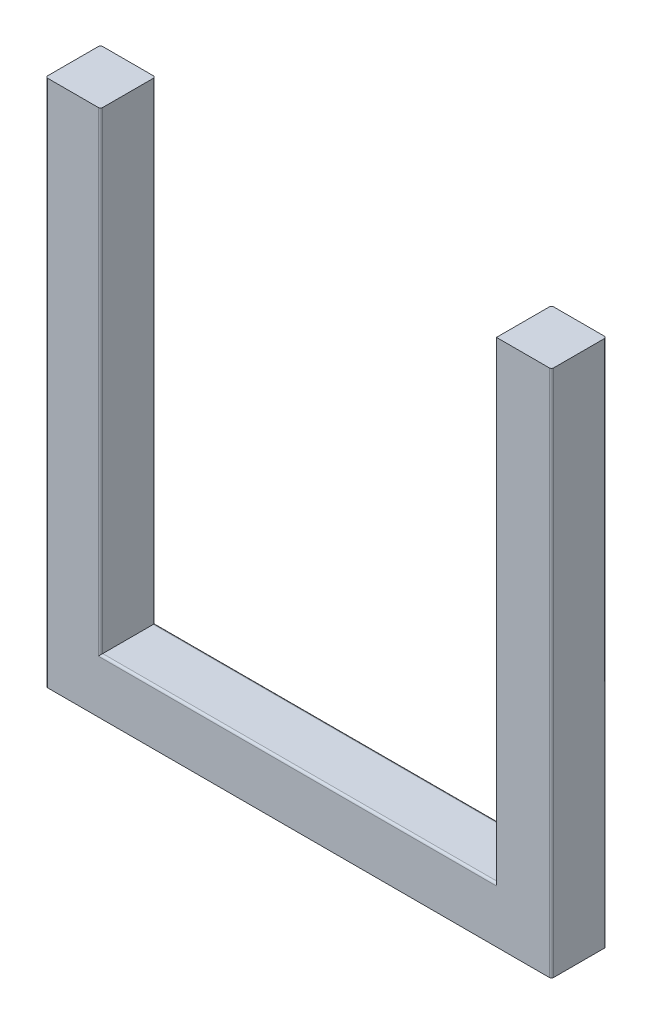
ISO-10303-21;
HEADER;
FILE_DESCRIPTION(('STEP AP214'),'2;1');
FILE_NAME('part.step','',(''),(''),'','','');
FILE_SCHEMA(('AUTOMOTIVE_DESIGN { 1 0 10303 214 1 1 1 1 }'));
ENDSEC;
DATA;
#1=APPLICATION_CONTEXT('core data for automotive mechanical design processes');
#2=APPLICATION_PROTOCOL_DEFINITION('international standard','automotive_design',2000,#1);
#3=PRODUCT_CONTEXT('',#1,'mechanical');
#4=PRODUCT('Part','Part','',(#3));
#5=PRODUCT_RELATED_PRODUCT_CATEGORY('part','',(#4));
#6=PRODUCT_DEFINITION_FORMATION('','',#4);
#7=PRODUCT_DEFINITION_CONTEXT('part definition',#1,'design');
#8=PRODUCT_DEFINITION('design','',#6,#7);
#9=PRODUCT_DEFINITION_SHAPE('','',#8);
#10=(LENGTH_UNIT() NAMED_UNIT(*) SI_UNIT(.MILLI.,.METRE.));
#11=(NAMED_UNIT(*) PLANE_ANGLE_UNIT() SI_UNIT($,.RADIAN.));
#12=(NAMED_UNIT(*) SI_UNIT($,.STERADIAN.) SOLID_ANGLE_UNIT());
#13=UNCERTAINTY_MEASURE_WITH_UNIT(LENGTH_MEASURE(1.E-05),#10,'distance_accuracy_value','');
#14=(GEOMETRIC_REPRESENTATION_CONTEXT(3) GLOBAL_UNCERTAINTY_ASSIGNED_CONTEXT((#13)) GLOBAL_UNIT_ASSIGNED_CONTEXT((#10,
#11,#12)) REPRESENTATION_CONTEXT('',''));
#15=CARTESIAN_POINT('',(0.,0.,0.));
#16=DIRECTION('',(0.,0.,1.));
#17=DIRECTION('',(1.,0.,0.));
#18=AXIS2_PLACEMENT_3D('',#15,#16,#17);
#19=CARTESIAN_POINT('',(49.9999999999998,0.,50.));
#20=DIRECTION('',(1.,0.,0.));
#21=DIRECTION('',(0.,0.,-1.));
#22=AXIS2_PLACEMENT_3D('',#19,#20,#21);
#23=PLANE('',#22);
#24=DIRECTION('',(0.,0.,-1.));
#25=VECTOR('',#24,1.);
#26=CARTESIAN_POINT('',(49.9999999999998,480.,50.));
#27=LINE('',#26,#25);
#28=CARTESIAN_POINT('',(49.9999999999998,480.,48.));
#29=VERTEX_POINT('',#28);
#30=CARTESIAN_POINT('',(49.9999999999998,480.,2.));
#31=VERTEX_POINT('',#30);
#32=EDGE_CURVE('E199',#29,#31,#27,.T.);
#33=ORIENTED_EDGE('',*,*,#32,.F.);
#34=DIRECTION('',(0.,-1.,0.));
#35=VECTOR('',#34,1.);
#36=CARTESIAN_POINT('',(49.9999999999998,0.,48.));
#37=LINE('',#36,#35);
#38=CARTESIAN_POINT('',(49.9999999999998,50.,48.));
#39=VERTEX_POINT('',#38);
#40=EDGE_CURVE('E215',#29,#39,#37,.T.);
#41=ORIENTED_EDGE('',*,*,#40,.T.);
#42=DIRECTION('',(0.,0.,-1.));
#43=VECTOR('',#42,1.);
#44=CARTESIAN_POINT('',(49.9999999999998,50.,50.));
#45=LINE('',#44,#43);
#46=CARTESIAN_POINT('',(49.9999999999998,50.,2.));
#47=VERTEX_POINT('',#46);
#48=EDGE_CURVE('E173',#39,#47,#45,.T.);
#49=ORIENTED_EDGE('',*,*,#48,.T.);
#50=DIRECTION('',(0.,-1.,0.));
#51=VECTOR('',#50,1.);
#52=CARTESIAN_POINT('',(49.9999999999998,480.,2.));
#53=LINE('',#52,#51);
#54=EDGE_CURVE('E213',#47,#31,#53,.F.);
#55=ORIENTED_EDGE('',*,*,#54,.T.);
#56=EDGE_LOOP('',(#33,#41,#49,#55));
#57=FACE_BOUND('',#56,.T.);
#58=ADVANCED_FACE('F35',(#57),#23,.T.);
#59=CARTESIAN_POINT('',(0.,480.,50.));
#60=DIRECTION('',(0.,1.,0.));
#61=DIRECTION('',(0.,0.,1.));
#62=AXIS2_PLACEMENT_3D('',#59,#60,#61);
#63=PLANE('',#62);
#64=DIRECTION('',(1.,0.,0.));
#65=VECTOR('',#64,1.);
#66=CARTESIAN_POINT('',(0.,480.,50.));
#67=LINE('',#66,#65);
#68=CARTESIAN_POINT('',(2.,480.,50.));
#69=VERTEX_POINT('',#68);
#70=CARTESIAN_POINT('',(47.9999999999998,480.,50.));
#71=VERTEX_POINT('',#70);
#72=EDGE_CURVE('E184',#69,#71,#67,.T.);
#73=ORIENTED_EDGE('',*,*,#72,.T.);
#74=CARTESIAN_POINT('',(47.9999999999998,480.,48.));
#75=DIRECTION('',(0.,1.,0.));
#76=DIRECTION('',(0.,0.,1.));
#77=AXIS2_PLACEMENT_3D('',#74,#75,#76);
#78=CIRCLE('',#77,2.);
#79=EDGE_CURVE('E223',#71,#29,#78,.T.);
#80=ORIENTED_EDGE('',*,*,#79,.T.);
#81=ORIENTED_EDGE('',*,*,#32,.T.);
#82=CARTESIAN_POINT('',(47.9999999999998,480.,2.));
#83=DIRECTION('',(0.,1.,0.));
#84=DIRECTION('',(0.,0.,1.));
#85=AXIS2_PLACEMENT_3D('',#82,#83,#84);
#86=CIRCLE('',#85,2.);
#87=CARTESIAN_POINT('',(47.9999999999998,480.,0.));
#88=VERTEX_POINT('',#87);
#89=EDGE_CURVE('E217',#31,#88,#86,.T.);
#90=ORIENTED_EDGE('',*,*,#89,.T.);
#91=DIRECTION('',(1.,0.,0.));
#92=VECTOR('',#91,1.);
#93=CARTESIAN_POINT('',(0.,480.,0.));
#94=LINE('',#93,#92);
#95=CARTESIAN_POINT('',(2.,480.,0.));
#96=VERTEX_POINT('',#95);
#97=EDGE_CURVE('E179',#96,#88,#94,.T.);
#98=ORIENTED_EDGE('',*,*,#97,.F.);
#99=CARTESIAN_POINT('',(2.,480.,2.));
#100=DIRECTION('',(0.,1.,0.));
#101=DIRECTION('',(0.,0.,1.));
#102=AXIS2_PLACEMENT_3D('',#99,#100,#101);
#103=CIRCLE('',#102,2.);
#104=CARTESIAN_POINT('',(0.,480.,2.));
#105=VERTEX_POINT('',#104);
#106=EDGE_CURVE('E219',#96,#105,#103,.T.);
#107=ORIENTED_EDGE('',*,*,#106,.T.);
#108=DIRECTION('',(0.,0.,-1.));
#109=VECTOR('',#108,1.);
#110=CARTESIAN_POINT('',(0.,480.,50.));
#111=LINE('',#110,#109);
#112=CARTESIAN_POINT('',(0.,480.,48.));
#113=VERTEX_POINT('',#112);
#114=EDGE_CURVE('E196',#113,#105,#111,.T.);
#115=ORIENTED_EDGE('',*,*,#114,.F.);
#116=CARTESIAN_POINT('',(2.,480.,48.));
#117=DIRECTION('',(0.,1.,0.));
#118=DIRECTION('',(0.,0.,1.));
#119=AXIS2_PLACEMENT_3D('',#116,#117,#118);
#120=CIRCLE('',#119,2.);
#121=EDGE_CURVE('E221',#113,#69,#120,.T.);
#122=ORIENTED_EDGE('',*,*,#121,.T.);
#123=EDGE_LOOP('',(#73,#80,#81,#90,#98,#107,#115,#122));
#124=FACE_BOUND('',#123,.T.);
#125=ADVANCED_FACE('F300',(#124),#63,.T.);
#126=CARTESIAN_POINT('',(0.,0.,50.));
#127=DIRECTION('',(-1.,0.,0.));
#128=DIRECTION('',(0.,0.,1.));
#129=AXIS2_PLACEMENT_3D('',#126,#127,#128);
#130=PLANE('',#129);
#131=DIRECTION('',(0.,0.,-1.));
#132=VECTOR('',#131,1.);
#133=CARTESIAN_POINT('',(0.,0.,50.));
#134=LINE('',#133,#132);
#135=CARTESIAN_POINT('',(0.,0.,48.));
#136=VERTEX_POINT('',#135);
#137=CARTESIAN_POINT('',(0.,0.,2.));
#138=VERTEX_POINT('',#137);
#139=EDGE_CURVE('E193',#136,#138,#134,.T.);
#140=ORIENTED_EDGE('',*,*,#139,.F.);
#141=DIRECTION('',(0.,1.,0.));
#142=VECTOR('',#141,1.);
#143=CARTESIAN_POINT('',(0.,0.,48.));
#144=LINE('',#143,#142);
#145=EDGE_CURVE('E227',#136,#113,#144,.T.);
#146=ORIENTED_EDGE('',*,*,#145,.T.);
#147=ORIENTED_EDGE('',*,*,#114,.T.);
#148=DIRECTION('',(0.,1.,0.));
#149=VECTOR('',#148,1.);
#150=CARTESIAN_POINT('',(0.,0.,2.));
#151=LINE('',#150,#149);
#152=EDGE_CURVE('E225',#105,#138,#151,.F.);
#153=ORIENTED_EDGE('',*,*,#152,.T.);
#154=EDGE_LOOP('',(#140,#146,#147,#153));
#155=FACE_BOUND('',#154,.T.);
#156=ADVANCED_FACE('F327',(#155),#130,.T.);
#157=CARTESIAN_POINT('',(0.,0.,50.));
#158=DIRECTION('',(0.,1.,0.));
#159=DIRECTION('',(0.,0.,1.));
#160=AXIS2_PLACEMENT_3D('',#157,#158,#159);
#161=PLANE('',#160);
#162=DIRECTION('',(1.,0.,0.));
#163=VECTOR('',#162,1.);
#164=CARTESIAN_POINT('',(0.,0.,50.));
#165=LINE('',#164,#163);
#166=CARTESIAN_POINT('',(2.,0.,50.));
#167=VERTEX_POINT('',#166);
#168=CARTESIAN_POINT('',(458.,0.,50.));
#169=VERTEX_POINT('',#168);
#170=EDGE_CURVE('E156',#167,#169,#165,.T.);
#171=ORIENTED_EDGE('',*,*,#170,.F.);
#172=CARTESIAN_POINT('',(2.,0.,48.));
#173=DIRECTION('',(0.,1.,0.));
#174=DIRECTION('',(0.,0.,1.));
#175=AXIS2_PLACEMENT_3D('',#172,#173,#174);
#176=CIRCLE('',#175,2.);
#177=EDGE_CURVE('E234',#167,#136,#176,.F.);
#178=ORIENTED_EDGE('',*,*,#177,.T.);
#179=ORIENTED_EDGE('',*,*,#139,.T.);
#180=DIRECTION('',(1.,0.,0.));
#181=VECTOR('',#180,1.);
#182=CARTESIAN_POINT('',(0.,0.,2.));
#183=LINE('',#182,#181);
#184=CARTESIAN_POINT('',(460.,0.,2.));
#185=VERTEX_POINT('',#184);
#186=EDGE_CURVE('E230',#138,#185,#183,.T.);
#187=ORIENTED_EDGE('',*,*,#186,.T.);
#188=DIRECTION('',(0.,0.,-1.));
#189=VECTOR('',#188,1.);
#190=CARTESIAN_POINT('',(460.,0.,50.));
#191=LINE('',#190,#189);
#192=CARTESIAN_POINT('',(460.,0.,48.));
#193=VERTEX_POINT('',#192);
#194=EDGE_CURVE('E190',#193,#185,#191,.T.);
#195=ORIENTED_EDGE('',*,*,#194,.F.);
#196=CARTESIAN_POINT('',(458.,0.,48.));
#197=DIRECTION('',(0.,1.,0.));
#198=DIRECTION('',(0.,0.,1.));
#199=AXIS2_PLACEMENT_3D('',#196,#197,#198);
#200=CIRCLE('',#199,2.);
#201=EDGE_CURVE('E232',#193,#169,#200,.F.);
#202=ORIENTED_EDGE('',*,*,#201,.T.);
#203=EDGE_LOOP('',(#171,#178,#179,#187,#195,#202));
#204=FACE_BOUND('',#203,.T.);
#205=ADVANCED_FACE('F325',(#204),#161,.F.);
#206=CARTESIAN_POINT('',(460.,0.,50.));
#207=DIRECTION('',(-1.,0.,0.));
#208=DIRECTION('',(0.,0.,1.));
#209=AXIS2_PLACEMENT_3D('',#206,#207,#208);
#210=PLANE('',#209);
#211=DIRECTION('',(0.,0.,-1.));
#212=VECTOR('',#211,1.);
#213=CARTESIAN_POINT('',(460.,480.,50.));
#214=LINE('',#213,#212);
#215=CARTESIAN_POINT('',(460.,480.,48.));
#216=VERTEX_POINT('',#215);
#217=CARTESIAN_POINT('',(460.,480.,2.));
#218=VERTEX_POINT('',#217);
#219=EDGE_CURVE('E166',#216,#218,#214,.T.);
#220=ORIENTED_EDGE('',*,*,#219,.F.);
#221=DIRECTION('',(0.,1.,0.));
#222=VECTOR('',#221,1.);
#223=CARTESIAN_POINT('',(460.,0.,48.));
#224=LINE('',#223,#222);
#225=EDGE_CURVE('E244',#216,#193,#224,.F.);
#226=ORIENTED_EDGE('',*,*,#225,.T.);
#227=ORIENTED_EDGE('',*,*,#194,.T.);
#228=DIRECTION('',(0.,1.,0.));
#229=VECTOR('',#228,1.);
#230=CARTESIAN_POINT('',(460.,0.,2.));
#231=LINE('',#230,#229);
#232=EDGE_CURVE('E241',#185,#218,#231,.T.);
#233=ORIENTED_EDGE('',*,*,#232,.T.);
#234=EDGE_LOOP('',(#220,#226,#227,#233));
#235=FACE_BOUND('',#234,.T.);
#236=ADVANCED_FACE('F283',(#235),#210,.F.);
#237=CARTESIAN_POINT('',(0.,480.,50.));
#238=DIRECTION('',(0.,-1.,0.));
#239=DIRECTION('',(0.,0.,-1.));
#240=AXIS2_PLACEMENT_3D('',#237,#238,#239);
#241=PLANE('',#240);
#242=DIRECTION('',(-1.,0.,0.));
#243=VECTOR('',#242,1.);
#244=CARTESIAN_POINT('',(0.,480.,50.));
#245=LINE('',#244,#243);
#246=CARTESIAN_POINT('',(458.,480.,50.));
#247=VERTEX_POINT('',#246);
#248=CARTESIAN_POINT('',(410.,480.,50.));
#249=VERTEX_POINT('',#248);
#250=EDGE_CURVE('E146',#247,#249,#245,.T.);
#251=ORIENTED_EDGE('',*,*,#250,.F.);
#252=CARTESIAN_POINT('',(458.,480.,48.));
#253=DIRECTION('',(0.,-1.,0.));
#254=DIRECTION('',(0.,0.,-1.));
#255=AXIS2_PLACEMENT_3D('',#252,#253,#254);
#256=CIRCLE('',#255,2.);
#257=EDGE_CURVE('E239',#247,#216,#256,.F.);
#258=ORIENTED_EDGE('',*,*,#257,.T.);
#259=ORIENTED_EDGE('',*,*,#219,.T.);
#260=CARTESIAN_POINT('',(458.,480.,2.));
#261=DIRECTION('',(0.,-1.,0.));
#262=DIRECTION('',(0.,0.,-1.));
#263=AXIS2_PLACEMENT_3D('',#260,#261,#262);
#264=CIRCLE('',#263,2.);
#265=CARTESIAN_POINT('',(458.,480.,0.));
#266=VERTEX_POINT('',#265);
#267=EDGE_CURVE('E237',#218,#266,#264,.F.);
#268=ORIENTED_EDGE('',*,*,#267,.T.);
#269=DIRECTION('',(-1.,0.,0.));
#270=VECTOR('',#269,1.);
#271=CARTESIAN_POINT('',(0.,480.,0.));
#272=LINE('',#271,#270);
#273=CARTESIAN_POINT('',(412.,480.,0.));
#274=VERTEX_POINT('',#273);
#275=EDGE_CURVE('E182',#266,#274,#272,.T.);
#276=ORIENTED_EDGE('',*,*,#275,.T.);
#277=CARTESIAN_POINT('',(412.,480.,2.));
#278=DIRECTION('',(0.,-1.,0.));
#279=DIRECTION('',(0.,0.,-1.));
#280=AXIS2_PLACEMENT_3D('',#277,#278,#279);
#281=CIRCLE('',#280,2.);
#282=CARTESIAN_POINT('',(410.,480.,2.));
#283=VERTEX_POINT('',#282);
#284=EDGE_CURVE('E163',#274,#283,#281,.F.);
#285=ORIENTED_EDGE('',*,*,#284,.T.);
#286=DIRECTION('',(0.,0.,-1.));
#287=VECTOR('',#286,1.);
#288=CARTESIAN_POINT('',(410.,480.,50.));
#289=LINE('',#288,#287);
#290=EDGE_CURVE('E159',#249,#283,#289,.T.);
#291=ORIENTED_EDGE('',*,*,#290,.F.);
#292=EDGE_LOOP('',(#251,#258,#259,#268,#276,#285,#291));
#293=FACE_BOUND('',#292,.T.);
#294=ADVANCED_FACE('F160',(#293),#241,.F.);
#295=CARTESIAN_POINT('',(410.,0.,50.));
#296=DIRECTION('',(-1.,0.,0.));
#297=DIRECTION('',(0.,0.,1.));
#298=AXIS2_PLACEMENT_3D('',#295,#296,#297);
#299=PLANE('',#298);
#300=ORIENTED_EDGE('',*,*,#290,.T.);
#301=DIRECTION('',(0.,1.,0.));
#302=VECTOR('',#301,1.);
#303=CARTESIAN_POINT('',(410.,50.,2.));
#304=LINE('',#303,#302);
#305=CARTESIAN_POINT('',(410.,50.,2.));
#306=VERTEX_POINT('',#305);
#307=EDGE_CURVE('E44',#283,#306,#304,.F.);
#308=ORIENTED_EDGE('',*,*,#307,.T.);
#309=DIRECTION('',(0.,0.,-1.));
#310=VECTOR('',#309,1.);
#311=CARTESIAN_POINT('',(410.,50.,50.));
#312=LINE('',#311,#310);
#313=CARTESIAN_POINT('',(410.,50.,48.));
#314=VERTEX_POINT('',#313);
#315=EDGE_CURVE('E167',#314,#306,#312,.T.);
#316=ORIENTED_EDGE('',*,*,#315,.F.);
#317=CARTESIAN_POINT('',(410.,48.,48.));
#318=DIRECTION('',(-1.,0.,0.));
#319=DIRECTION('',(0.,0.,1.));
#320=AXIS2_PLACEMENT_3D('',#317,#318,#319);
#321=CIRCLE('',#320,2.);
#322=CARTESIAN_POINT('',(410.,48.,50.));
#323=VERTEX_POINT('',#322);
#324=EDGE_CURVE('E11',#314,#323,#321,.F.);
#325=ORIENTED_EDGE('',*,*,#324,.T.);
#326=DIRECTION('',(0.,1.,0.));
#327=VECTOR('',#326,1.);
#328=CARTESIAN_POINT('',(410.,0.,50.));
#329=LINE('',#328,#327);
#330=EDGE_CURVE('E151',#323,#249,#329,.T.);
#331=ORIENTED_EDGE('',*,*,#330,.T.);
#332=EDGE_LOOP('',(#300,#308,#316,#325,#331));
#333=FACE_BOUND('',#332,.T.);
#334=ADVANCED_FACE('F169',(#333),#299,.T.);
#335=CARTESIAN_POINT('',(0.,50.,50.));
#336=DIRECTION('',(0.,-1.,0.));
#337=DIRECTION('',(1.,0.,0.));
#338=AXIS2_PLACEMENT_3D('',#335,#336,#337);
#339=PLANE('',#338);
#340=ORIENTED_EDGE('',*,*,#48,.F.);
#341=DIRECTION('',(-1.,0.,0.));
#342=VECTOR('',#341,1.);
#343=CARTESIAN_POINT('',(410.,50.,48.));
#344=LINE('',#343,#342);
#345=EDGE_CURVE('E211',#39,#314,#344,.F.);
#346=ORIENTED_EDGE('',*,*,#345,.T.);
#347=ORIENTED_EDGE('',*,*,#315,.T.);
#348=DIRECTION('',(-1.,0.,0.));
#349=VECTOR('',#348,1.);
#350=CARTESIAN_POINT('',(0.,50.,2.));
#351=LINE('',#350,#349);
#352=EDGE_CURVE('E209',#306,#47,#351,.T.);
#353=ORIENTED_EDGE('',*,*,#352,.T.);
#354=EDGE_LOOP('',(#340,#346,#347,#353));
#355=FACE_BOUND('',#354,.T.);
#356=ADVANCED_FACE('F310',(#355),#339,.F.);
#357=CARTESIAN_POINT('',(0.,0.,50.));
#358=DIRECTION('',(0.,0.,1.));
#359=DIRECTION('',(1.,0.,0.));
#360=AXIS2_PLACEMENT_3D('',#357,#358,#359);
#361=PLANE('',#360);
#362=ORIENTED_EDGE('',*,*,#330,.F.);
#363=DIRECTION('',(-1.,0.,0.));
#364=VECTOR('',#363,1.);
#365=CARTESIAN_POINT('',(49.9999999999998,48.,50.));
#366=LINE('',#365,#364);
#367=CARTESIAN_POINT('',(47.9999999999998,48.,50.));
#368=VERTEX_POINT('',#367);
#369=EDGE_CURVE('E207',#323,#368,#366,.T.);
#370=ORIENTED_EDGE('',*,*,#369,.T.);
#371=DIRECTION('',(0.,-1.,0.));
#372=VECTOR('',#371,1.);
#373=CARTESIAN_POINT('',(47.9999999999998,0.,50.));
#374=LINE('',#373,#372);
#375=EDGE_CURVE('E205',#368,#71,#374,.F.);
#376=ORIENTED_EDGE('',*,*,#375,.T.);
#377=ORIENTED_EDGE('',*,*,#72,.F.);
#378=DIRECTION('',(0.,1.,0.));
#379=VECTOR('',#378,1.);
#380=CARTESIAN_POINT('',(2.,0.,50.));
#381=LINE('',#380,#379);
#382=EDGE_CURVE('E203',#69,#167,#381,.F.);
#383=ORIENTED_EDGE('',*,*,#382,.T.);
#384=ORIENTED_EDGE('',*,*,#170,.T.);
#385=DIRECTION('',(0.,1.,0.));
#386=VECTOR('',#385,1.);
#387=CARTESIAN_POINT('',(458.,480.,50.));
#388=LINE('',#387,#386);
#389=EDGE_CURVE('E154',#169,#247,#388,.T.);
#390=ORIENTED_EDGE('',*,*,#389,.T.);
#391=ORIENTED_EDGE('',*,*,#250,.T.);
#392=EDGE_LOOP('',(#362,#370,#376,#377,#383,#384,#390,#391));
#393=FACE_BOUND('',#392,.T.);
#394=ADVANCED_FACE('F148',(#393),#361,.T.);
#395=CARTESIAN_POINT('',(0.,0.,0.));
#396=DIRECTION('',(0.,0.,1.));
#397=DIRECTION('',(1.,0.,0.));
#398=AXIS2_PLACEMENT_3D('',#395,#396,#397);
#399=PLANE('',#398);
#400=ORIENTED_EDGE('',*,*,#275,.F.);
#401=DIRECTION('',(0.,1.,0.));
#402=VECTOR('',#401,1.);
#403=CARTESIAN_POINT('',(458.,0.,0.));
#404=LINE('',#403,#402);
#405=CARTESIAN_POINT('',(458.,2.,0.));
#406=VERTEX_POINT('',#405);
#407=EDGE_CURVE('E52',#266,#406,#404,.F.);
#408=ORIENTED_EDGE('',*,*,#407,.T.);
#409=DIRECTION('',(1.,0.,0.));
#410=VECTOR('',#409,1.);
#411=CARTESIAN_POINT('',(0.,2.,0.));
#412=LINE('',#411,#410);
#413=CARTESIAN_POINT('',(2.,2.,0.));
#414=VERTEX_POINT('',#413);
#415=EDGE_CURVE('E56',#406,#414,#412,.F.);
#416=ORIENTED_EDGE('',*,*,#415,.T.);
#417=DIRECTION('',(0.,1.,0.));
#418=VECTOR('',#417,1.);
#419=CARTESIAN_POINT('',(2.,480.,0.));
#420=LINE('',#419,#418);
#421=EDGE_CURVE('E253',#414,#96,#420,.T.);
#422=ORIENTED_EDGE('',*,*,#421,.T.);
#423=ORIENTED_EDGE('',*,*,#97,.T.);
#424=DIRECTION('',(0.,-1.,0.));
#425=VECTOR('',#424,1.);
#426=CARTESIAN_POINT('',(47.9999999999998,50.,0.));
#427=LINE('',#426,#425);
#428=CARTESIAN_POINT('',(47.9999999999998,48.,0.));
#429=VERTEX_POINT('',#428);
#430=EDGE_CURVE('E250',#88,#429,#427,.T.);
#431=ORIENTED_EDGE('',*,*,#430,.T.);
#432=DIRECTION('',(-1.,0.,0.));
#433=VECTOR('',#432,1.);
#434=CARTESIAN_POINT('',(0.,48.,0.));
#435=LINE('',#434,#433);
#436=CARTESIAN_POINT('',(412.,48.,0.));
#437=VERTEX_POINT('',#436);
#438=EDGE_CURVE('E246',#429,#437,#435,.F.);
#439=ORIENTED_EDGE('',*,*,#438,.T.);
#440=DIRECTION('',(0.,1.,0.));
#441=VECTOR('',#440,1.);
#442=CARTESIAN_POINT('',(412.,480.,0.));
#443=LINE('',#442,#441);
#444=EDGE_CURVE('E248',#437,#274,#443,.T.);
#445=ORIENTED_EDGE('',*,*,#444,.T.);
#446=EDGE_LOOP('',(#400,#408,#416,#422,#423,#431,#439,#445));
#447=FACE_BOUND('',#446,.T.);
#448=ADVANCED_FACE('F277',(#447),#399,.F.);
#449=CARTESIAN_POINT('',(47.9999999999998,0.,48.));
#450=DIRECTION('',(0.,-1.,0.));
#451=DIRECTION('',(0.,0.,-1.));
#452=AXIS2_PLACEMENT_3D('',#449,#450,#451);
#453=CYLINDRICAL_SURFACE('',#452,2.);
#454=ORIENTED_EDGE('',*,*,#79,.F.);
#455=ORIENTED_EDGE('',*,*,#375,.F.);
#456=CARTESIAN_POINT('',(47.9999999999998,48.,48.));
#457=DIRECTION('',(0.707106781186547,-0.707106781186547,0.));
#458=DIRECTION('',(0.707106781186547,0.707106781186547,0.));
#459=AXIS2_PLACEMENT_3D('',#456,#457,#458);
#460=ELLIPSE('',#459,2.82842712474619,2.);
#461=EDGE_CURVE('E183',#39,#368,#460,.T.);
#462=ORIENTED_EDGE('',*,*,#461,.F.);
#463=ORIENTED_EDGE('',*,*,#40,.F.);
#464=EDGE_LOOP('',(#454,#455,#462,#463));
#465=FACE_BOUND('',#464,.T.);
#466=ADVANCED_FACE('F317',(#465),#453,.T.);
#467=CARTESIAN_POINT('',(0.,48.,48.));
#468=DIRECTION('',(1.,0.,0.));
#469=DIRECTION('',(0.,1.,0.));
#470=AXIS2_PLACEMENT_3D('',#467,#468,#469);
#471=CYLINDRICAL_SURFACE('',#470,2.);
#472=ORIENTED_EDGE('',*,*,#324,.F.);
#473=ORIENTED_EDGE('',*,*,#345,.F.);
#474=ORIENTED_EDGE('',*,*,#461,.T.);
#475=ORIENTED_EDGE('',*,*,#369,.F.);
#476=EDGE_LOOP('',(#472,#473,#474,#475));
#477=FACE_BOUND('',#476,.T.);
#478=ADVANCED_FACE('F313',(#477),#471,.T.);
#479=CARTESIAN_POINT('',(2.,0.,48.));
#480=DIRECTION('',(0.,1.,0.));
#481=DIRECTION('',(0.,0.,1.));
#482=AXIS2_PLACEMENT_3D('',#479,#480,#481);
#483=CYLINDRICAL_SURFACE('',#482,2.);
#484=ORIENTED_EDGE('',*,*,#177,.F.);
#485=ORIENTED_EDGE('',*,*,#382,.F.);
#486=ORIENTED_EDGE('',*,*,#121,.F.);
#487=ORIENTED_EDGE('',*,*,#145,.F.);
#488=EDGE_LOOP('',(#484,#485,#486,#487));
#489=FACE_BOUND('',#488,.T.);
#490=ADVANCED_FACE('F345',(#489),#483,.T.);
#491=CARTESIAN_POINT('',(458.,0.,48.));
#492=DIRECTION('',(0.,-1.,0.));
#493=DIRECTION('',(0.,0.,-1.));
#494=AXIS2_PLACEMENT_3D('',#491,#492,#493);
#495=CYLINDRICAL_SURFACE('',#494,2.);
#496=ORIENTED_EDGE('',*,*,#201,.F.);
#497=ORIENTED_EDGE('',*,*,#225,.F.);
#498=ORIENTED_EDGE('',*,*,#257,.F.);
#499=ORIENTED_EDGE('',*,*,#389,.F.);
#500=EDGE_LOOP('',(#496,#497,#498,#499));
#501=FACE_BOUND('',#500,.T.);
#502=ADVANCED_FACE('F324',(#501),#495,.T.);
#503=CARTESIAN_POINT('',(2.,0.,2.));
#504=DIRECTION('',(0.,-1.,0.));
#505=DIRECTION('',(0.,0.,-1.));
#506=AXIS2_PLACEMENT_3D('',#503,#504,#505);
#507=CYLINDRICAL_SURFACE('',#506,2.);
#508=ORIENTED_EDGE('',*,*,#106,.F.);
#509=ORIENTED_EDGE('',*,*,#421,.F.);
#510=CARTESIAN_POINT('',(2.,2.,2.));
#511=DIRECTION('',(0.707106781186547,-0.707106781186547,0.));
#512=DIRECTION('',(-0.707106781186547,-0.707106781186547,0.));
#513=AXIS2_PLACEMENT_3D('',#510,#511,#512);
#514=ELLIPSE('',#513,2.82842712474619,2.);
#515=EDGE_CURVE('E259',#138,#414,#514,.T.);
#516=ORIENTED_EDGE('',*,*,#515,.F.);
#517=ORIENTED_EDGE('',*,*,#152,.F.);
#518=EDGE_LOOP('',(#508,#509,#516,#517));
#519=FACE_BOUND('',#518,.T.);
#520=ADVANCED_FACE('F296',(#519),#507,.T.);
#521=CARTESIAN_POINT('',(0.,2.,2.));
#522=DIRECTION('',(1.,0.,0.));
#523=DIRECTION('',(0.,0.,-1.));
#524=AXIS2_PLACEMENT_3D('',#521,#522,#523);
#525=CYLINDRICAL_SURFACE('',#524,2.);
#526=ORIENTED_EDGE('',*,*,#515,.T.);
#527=ORIENTED_EDGE('',*,*,#415,.F.);
#528=CARTESIAN_POINT('',(458.,2.,2.));
#529=DIRECTION('',(0.707106781186547,0.707106781186547,0.));
#530=DIRECTION('',(0.707106781186547,-0.707106781186547,0.));
#531=AXIS2_PLACEMENT_3D('',#528,#529,#530);
#532=ELLIPSE('',#531,2.82842712474619,2.);
#533=EDGE_CURVE('E260',#185,#406,#532,.T.);
#534=ORIENTED_EDGE('',*,*,#533,.F.);
#535=ORIENTED_EDGE('',*,*,#186,.F.);
#536=EDGE_LOOP('',(#526,#527,#534,#535));
#537=FACE_BOUND('',#536,.T.);
#538=ADVANCED_FACE('F291',(#537),#525,.T.);
#539=CARTESIAN_POINT('',(458.,0.,2.));
#540=DIRECTION('',(0.,1.,0.));
#541=DIRECTION('',(0.,0.,1.));
#542=AXIS2_PLACEMENT_3D('',#539,#540,#541);
#543=CYLINDRICAL_SURFACE('',#542,2.);
#544=ORIENTED_EDGE('',*,*,#533,.T.);
#545=ORIENTED_EDGE('',*,*,#407,.F.);
#546=ORIENTED_EDGE('',*,*,#267,.F.);
#547=ORIENTED_EDGE('',*,*,#232,.F.);
#548=EDGE_LOOP('',(#544,#545,#546,#547));
#549=FACE_BOUND('',#548,.T.);
#550=ADVANCED_FACE('F281',(#549),#543,.T.);
#551=CARTESIAN_POINT('',(412.,0.,2.));
#552=DIRECTION('',(0.,-1.,0.));
#553=DIRECTION('',(0.,0.,-1.));
#554=AXIS2_PLACEMENT_3D('',#551,#552,#553);
#555=CYLINDRICAL_SURFACE('',#554,2.);
#556=ORIENTED_EDGE('',*,*,#284,.F.);
#557=ORIENTED_EDGE('',*,*,#444,.F.);
#558=CARTESIAN_POINT('',(412.,48.,2.));
#559=DIRECTION('',(-0.707106781186547,-0.707106781186547,0.));
#560=DIRECTION('',(0.707106781186547,-0.707106781186547,0.));
#561=AXIS2_PLACEMENT_3D('',#558,#559,#560);
#562=ELLIPSE('',#561,2.82842712474619,2.);
#563=EDGE_CURVE('E39',#306,#437,#562,.T.);
#564=ORIENTED_EDGE('',*,*,#563,.F.);
#565=ORIENTED_EDGE('',*,*,#307,.F.);
#566=EDGE_LOOP('',(#556,#557,#564,#565));
#567=FACE_BOUND('',#566,.T.);
#568=ADVANCED_FACE('F37',(#567),#555,.T.);
#569=CARTESIAN_POINT('',(0.,48.,2.));
#570=DIRECTION('',(-1.,0.,0.));
#571=DIRECTION('',(0.,-1.,0.));
#572=AXIS2_PLACEMENT_3D('',#569,#570,#571);
#573=CYLINDRICAL_SURFACE('',#572,2.);
#574=ORIENTED_EDGE('',*,*,#563,.T.);
#575=ORIENTED_EDGE('',*,*,#438,.F.);
#576=CARTESIAN_POINT('',(47.9999999999998,48.,2.));
#577=DIRECTION('',(-0.707106781186547,0.707106781186547,0.));
#578=DIRECTION('',(0.707106781186547,0.707106781186547,0.));
#579=AXIS2_PLACEMENT_3D('',#576,#577,#578);
#580=ELLIPSE('',#579,2.82842712474619,2.);
#581=EDGE_CURVE('E264',#47,#429,#580,.T.);
#582=ORIENTED_EDGE('',*,*,#581,.F.);
#583=ORIENTED_EDGE('',*,*,#352,.F.);
#584=EDGE_LOOP('',(#574,#575,#582,#583));
#585=FACE_BOUND('',#584,.T.);
#586=ADVANCED_FACE('F274',(#585),#573,.T.);
#587=CARTESIAN_POINT('',(47.9999999999998,0.,2.));
#588=DIRECTION('',(0.,1.,0.));
#589=DIRECTION('',(0.,0.,1.));
#590=AXIS2_PLACEMENT_3D('',#587,#588,#589);
#591=CYLINDRICAL_SURFACE('',#590,2.);
#592=ORIENTED_EDGE('',*,*,#89,.F.);
#593=ORIENTED_EDGE('',*,*,#54,.F.);
#594=ORIENTED_EDGE('',*,*,#581,.T.);
#595=ORIENTED_EDGE('',*,*,#430,.F.);
#596=EDGE_LOOP('',(#592,#593,#594,#595));
#597=FACE_BOUND('',#596,.T.);
#598=ADVANCED_FACE('F304',(#597),#591,.T.);
#599=CLOSED_SHELL('',(#58,#125,#156,#205,#236,#294,#334,#356,#394,#448,#466,#478,#490,#502,#520,
#538,#550,#568,#586,#598));
#600=MANIFOLD_SOLID_BREP('B2',#599);
#601=ADVANCED_BREP_SHAPE_REPRESENTATION('',(#18,#600),#14);
#602=SHAPE_DEFINITION_REPRESENTATION(#9,#601);
ENDSEC;
END-ISO-10303-21;
